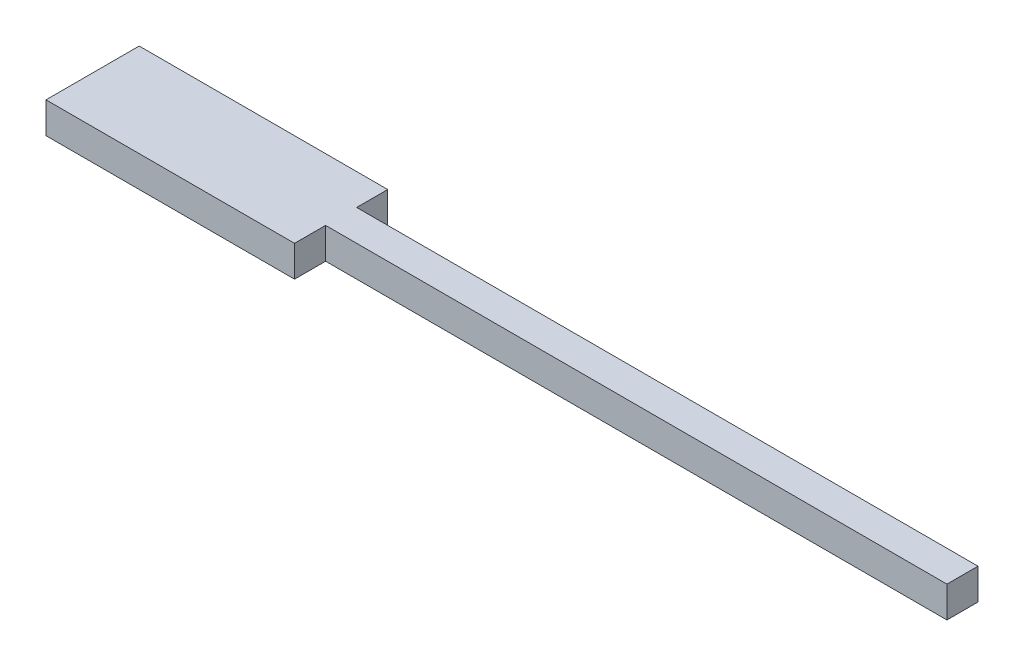
ISO-10303-21;
HEADER;
FILE_DESCRIPTION(('STEP AP214'),'2;1');
FILE_NAME('part.step','',(''),(''),'','','');
FILE_SCHEMA(('AUTOMOTIVE_DESIGN { 1 0 10303 214 1 1 1 1 }'));
ENDSEC;
DATA;
#1=APPLICATION_CONTEXT('core data for automotive mechanical design processes');
#2=APPLICATION_PROTOCOL_DEFINITION('international standard','automotive_design',2000,#1);
#3=PRODUCT_CONTEXT('',#1,'mechanical');
#4=PRODUCT('Part','Part','',(#3));
#5=PRODUCT_RELATED_PRODUCT_CATEGORY('part','',(#4));
#6=PRODUCT_DEFINITION_FORMATION('','',#4);
#7=PRODUCT_DEFINITION_CONTEXT('part definition',#1,'design');
#8=PRODUCT_DEFINITION('design','',#6,#7);
#9=PRODUCT_DEFINITION_SHAPE('','',#8);
#10=(LENGTH_UNIT() NAMED_UNIT(*) SI_UNIT(.MILLI.,.METRE.));
#11=(NAMED_UNIT(*) PLANE_ANGLE_UNIT() SI_UNIT($,.RADIAN.));
#12=(NAMED_UNIT(*) SI_UNIT($,.STERADIAN.) SOLID_ANGLE_UNIT());
#13=UNCERTAINTY_MEASURE_WITH_UNIT(LENGTH_MEASURE(1.E-05),#10,'distance_accuracy_value','');
#14=(GEOMETRIC_REPRESENTATION_CONTEXT(3) GLOBAL_UNCERTAINTY_ASSIGNED_CONTEXT((#13)) GLOBAL_UNIT_ASSIGNED_CONTEXT((#10,
#11,#12)) REPRESENTATION_CONTEXT('',''));
#15=CARTESIAN_POINT('',(0.,0.,0.));
#16=DIRECTION('',(0.,0.,1.));
#17=DIRECTION('',(1.,0.,0.));
#18=AXIS2_PLACEMENT_3D('',#15,#16,#17);
#19=CARTESIAN_POINT('',(0.,5.,-5.));
#20=DIRECTION('',(-1.,0.,0.));
#21=DIRECTION('',(0.,0.,1.));
#22=AXIS2_PLACEMENT_3D('',#19,#20,#21);
#23=PLANE('',#22);
#24=DIRECTION('',(0.,0.,-1.));
#25=VECTOR('',#24,1.);
#26=CARTESIAN_POINT('',(0.,0.,-5.));
#27=LINE('',#26,#25);
#28=CARTESIAN_POINT('',(0.,0.,0.));
#29=VERTEX_POINT('',#28);
#30=CARTESIAN_POINT('',(0.,0.,-5.));
#31=VERTEX_POINT('',#30);
#32=EDGE_CURVE('E140',#29,#31,#27,.T.);
#33=ORIENTED_EDGE('',*,*,#32,.T.);
#34=DIRECTION('',(0.,-1.,0.));
#35=VECTOR('',#34,1.);
#36=CARTESIAN_POINT('',(0.,5.,-5.));
#37=LINE('',#36,#35);
#38=CARTESIAN_POINT('',(0.,5.,-5.));
#39=VERTEX_POINT('',#38);
#40=EDGE_CURVE('E11',#39,#31,#37,.T.);
#41=ORIENTED_EDGE('',*,*,#40,.F.);
#42=DIRECTION('',(0.,0.,-1.));
#43=VECTOR('',#42,1.);
#44=CARTESIAN_POINT('',(0.,5.,-5.));
#45=LINE('',#44,#43);
#46=CARTESIAN_POINT('',(0.,5.,0.));
#47=VERTEX_POINT('',#46);
#48=EDGE_CURVE('E162',#47,#39,#45,.T.);
#49=ORIENTED_EDGE('',*,*,#48,.F.);
#50=DIRECTION('',(0.,-1.,0.));
#51=VECTOR('',#50,1.);
#52=CARTESIAN_POINT('',(0.,5.,0.));
#53=LINE('',#52,#51);
#54=EDGE_CURVE('E136',#47,#29,#53,.T.);
#55=ORIENTED_EDGE('',*,*,#54,.T.);
#56=EDGE_LOOP('',(#33,#41,#49,#55));
#57=FACE_BOUND('',#56,.T.);
#58=ADVANCED_FACE('F39',(#57),#23,.F.);
#59=CARTESIAN_POINT('',(0.,5.,-5.));
#60=DIRECTION('',(0.,0.,-1.));
#61=DIRECTION('',(-1.,0.,0.));
#62=AXIS2_PLACEMENT_3D('',#59,#60,#61);
#63=PLANE('',#62);
#64=DIRECTION('',(1.,0.,0.));
#65=VECTOR('',#64,1.);
#66=CARTESIAN_POINT('',(0.,0.,-5.));
#67=LINE('',#66,#65);
#68=CARTESIAN_POINT('',(100.,0.,-5.));
#69=VERTEX_POINT('',#68);
#70=EDGE_CURVE('E144',#31,#69,#67,.T.);
#71=ORIENTED_EDGE('',*,*,#70,.T.);
#72=DIRECTION('',(0.,-1.,0.));
#73=VECTOR('',#72,1.);
#74=CARTESIAN_POINT('',(100.,5.,-5.));
#75=LINE('',#74,#73);
#76=CARTESIAN_POINT('',(100.,5.,-5.));
#77=VERTEX_POINT('',#76);
#78=EDGE_CURVE('E48',#77,#69,#75,.T.);
#79=ORIENTED_EDGE('',*,*,#78,.F.);
#80=DIRECTION('',(1.,0.,0.));
#81=VECTOR('',#80,1.);
#82=CARTESIAN_POINT('',(0.,5.,-5.));
#83=LINE('',#82,#81);
#84=EDGE_CURVE('E99',#39,#77,#83,.T.);
#85=ORIENTED_EDGE('',*,*,#84,.F.);
#86=ORIENTED_EDGE('',*,*,#40,.T.);
#87=EDGE_LOOP('',(#71,#79,#85,#86));
#88=FACE_BOUND('',#87,.T.);
#89=ADVANCED_FACE('F208',(#88),#63,.F.);
#90=CARTESIAN_POINT('',(100.,5.,-10.));
#91=DIRECTION('',(-1.,0.,0.));
#92=DIRECTION('',(0.,0.,1.));
#93=AXIS2_PLACEMENT_3D('',#90,#91,#92);
#94=PLANE('',#93);
#95=DIRECTION('',(0.,0.,-1.));
#96=VECTOR('',#95,1.);
#97=CARTESIAN_POINT('',(100.,0.,-10.));
#98=LINE('',#97,#96);
#99=CARTESIAN_POINT('',(100.,0.,-10.));
#100=VERTEX_POINT('',#99);
#101=EDGE_CURVE('E147',#69,#100,#98,.T.);
#102=ORIENTED_EDGE('',*,*,#101,.T.);
#103=DIRECTION('',(0.,-1.,0.));
#104=VECTOR('',#103,1.);
#105=CARTESIAN_POINT('',(100.,5.,-10.));
#106=LINE('',#105,#104);
#107=CARTESIAN_POINT('',(100.,5.,-10.));
#108=VERTEX_POINT('',#107);
#109=EDGE_CURVE('E173',#108,#100,#106,.T.);
#110=ORIENTED_EDGE('',*,*,#109,.F.);
#111=DIRECTION('',(0.,0.,-1.));
#112=VECTOR('',#111,1.);
#113=CARTESIAN_POINT('',(100.,5.,-10.));
#114=LINE('',#113,#112);
#115=EDGE_CURVE('E183',#77,#108,#114,.T.);
#116=ORIENTED_EDGE('',*,*,#115,.F.);
#117=ORIENTED_EDGE('',*,*,#78,.T.);
#118=EDGE_LOOP('',(#102,#110,#116,#117));
#119=FACE_BOUND('',#118,.T.);
#120=ADVANCED_FACE('F181',(#119),#94,.F.);
#121=CARTESIAN_POINT('',(0.,5.,-9.99999999999999));
#122=DIRECTION('',(0.,0.,1.));
#123=DIRECTION('',(1.,0.,0.));
#124=AXIS2_PLACEMENT_3D('',#121,#122,#123);
#125=PLANE('',#124);
#126=DIRECTION('',(-1.,0.,0.));
#127=VECTOR('',#126,1.);
#128=CARTESIAN_POINT('',(0.,0.,-9.99999999999999));
#129=LINE('',#128,#127);
#130=CARTESIAN_POINT('',(0.,0.,-9.99999999999999));
#131=VERTEX_POINT('',#130);
#132=EDGE_CURVE('E150',#100,#131,#129,.T.);
#133=ORIENTED_EDGE('',*,*,#132,.T.);
#134=DIRECTION('',(0.,-1.,0.));
#135=VECTOR('',#134,1.);
#136=CARTESIAN_POINT('',(0.,5.,-9.99999999999999));
#137=LINE('',#136,#135);
#138=CARTESIAN_POINT('',(0.,5.,-9.99999999999999));
#139=VERTEX_POINT('',#138);
#140=EDGE_CURVE('E169',#139,#131,#137,.T.);
#141=ORIENTED_EDGE('',*,*,#140,.F.);
#142=DIRECTION('',(-1.,0.,0.));
#143=VECTOR('',#142,1.);
#144=CARTESIAN_POINT('',(0.,5.,-9.99999999999999));
#145=LINE('',#144,#143);
#146=EDGE_CURVE('E196',#108,#139,#145,.T.);
#147=ORIENTED_EDGE('',*,*,#146,.F.);
#148=ORIENTED_EDGE('',*,*,#109,.T.);
#149=EDGE_LOOP('',(#133,#141,#147,#148));
#150=FACE_BOUND('',#149,.T.);
#151=ADVANCED_FACE('F191',(#150),#125,.F.);
#152=CARTESIAN_POINT('',(0.,5.,-15.));
#153=DIRECTION('',(-1.,0.,0.));
#154=DIRECTION('',(0.,0.,1.));
#155=AXIS2_PLACEMENT_3D('',#152,#153,#154);
#156=PLANE('',#155);
#157=DIRECTION('',(0.,0.,-1.));
#158=VECTOR('',#157,1.);
#159=CARTESIAN_POINT('',(0.,0.,-15.));
#160=LINE('',#159,#158);
#161=CARTESIAN_POINT('',(0.,0.,-15.));
#162=VERTEX_POINT('',#161);
#163=EDGE_CURVE('E153',#131,#162,#160,.T.);
#164=ORIENTED_EDGE('',*,*,#163,.T.);
#165=DIRECTION('',(0.,-1.,0.));
#166=VECTOR('',#165,1.);
#167=CARTESIAN_POINT('',(0.,5.,-15.));
#168=LINE('',#167,#166);
#169=CARTESIAN_POINT('',(0.,5.,-15.));
#170=VERTEX_POINT('',#169);
#171=EDGE_CURVE('E129',#170,#162,#168,.T.);
#172=ORIENTED_EDGE('',*,*,#171,.F.);
#173=DIRECTION('',(0.,0.,-1.));
#174=VECTOR('',#173,1.);
#175=CARTESIAN_POINT('',(0.,5.,-15.));
#176=LINE('',#175,#174);
#177=EDGE_CURVE('E118',#139,#170,#176,.T.);
#178=ORIENTED_EDGE('',*,*,#177,.F.);
#179=ORIENTED_EDGE('',*,*,#140,.T.);
#180=EDGE_LOOP('',(#164,#172,#178,#179));
#181=FACE_BOUND('',#180,.T.);
#182=ADVANCED_FACE('F194',(#181),#156,.F.);
#183=CARTESIAN_POINT('',(0.,5.,-15.));
#184=DIRECTION('',(0.,0.,1.));
#185=DIRECTION('',(1.,0.,0.));
#186=AXIS2_PLACEMENT_3D('',#183,#184,#185);
#187=PLANE('',#186);
#188=DIRECTION('',(-1.,0.,0.));
#189=VECTOR('',#188,1.);
#190=CARTESIAN_POINT('',(0.,0.,-15.));
#191=LINE('',#190,#189);
#192=CARTESIAN_POINT('',(-40.,0.,-15.));
#193=VERTEX_POINT('',#192);
#194=EDGE_CURVE('E127',#162,#193,#191,.T.);
#195=ORIENTED_EDGE('',*,*,#194,.T.);
#196=DIRECTION('',(0.,-1.,0.));
#197=VECTOR('',#196,1.);
#198=CARTESIAN_POINT('',(-40.,5.,-15.));
#199=LINE('',#198,#197);
#200=CARTESIAN_POINT('',(-40.,5.,-15.));
#201=VERTEX_POINT('',#200);
#202=EDGE_CURVE('E124',#201,#193,#199,.T.);
#203=ORIENTED_EDGE('',*,*,#202,.F.);
#204=DIRECTION('',(-1.,0.,0.));
#205=VECTOR('',#204,1.);
#206=CARTESIAN_POINT('',(0.,5.,-15.));
#207=LINE('',#206,#205);
#208=EDGE_CURVE('E112',#170,#201,#207,.T.);
#209=ORIENTED_EDGE('',*,*,#208,.F.);
#210=ORIENTED_EDGE('',*,*,#171,.T.);
#211=EDGE_LOOP('',(#195,#203,#209,#210));
#212=FACE_BOUND('',#211,.T.);
#213=ADVANCED_FACE('F125',(#212),#187,.F.);
#214=CARTESIAN_POINT('',(-40.,5.,0.));
#215=DIRECTION('',(1.,0.,0.));
#216=DIRECTION('',(0.,0.,-1.));
#217=AXIS2_PLACEMENT_3D('',#214,#215,#216);
#218=PLANE('',#217);
#219=DIRECTION('',(0.,0.,1.));
#220=VECTOR('',#219,1.);
#221=CARTESIAN_POINT('',(-40.,0.,0.));
#222=LINE('',#221,#220);
#223=CARTESIAN_POINT('',(-40.,0.,0.));
#224=VERTEX_POINT('',#223);
#225=EDGE_CURVE('E85',#193,#224,#222,.T.);
#226=ORIENTED_EDGE('',*,*,#225,.T.);
#227=DIRECTION('',(0.,-1.,0.));
#228=VECTOR('',#227,1.);
#229=CARTESIAN_POINT('',(-40.,5.,0.));
#230=LINE('',#229,#228);
#231=CARTESIAN_POINT('',(-40.,5.,0.));
#232=VERTEX_POINT('',#231);
#233=EDGE_CURVE('E130',#232,#224,#230,.T.);
#234=ORIENTED_EDGE('',*,*,#233,.F.);
#235=DIRECTION('',(0.,0.,1.));
#236=VECTOR('',#235,1.);
#237=CARTESIAN_POINT('',(-40.,5.,0.));
#238=LINE('',#237,#236);
#239=EDGE_CURVE('E116',#201,#232,#238,.T.);
#240=ORIENTED_EDGE('',*,*,#239,.F.);
#241=ORIENTED_EDGE('',*,*,#202,.T.);
#242=EDGE_LOOP('',(#226,#234,#240,#241));
#243=FACE_BOUND('',#242,.T.);
#244=ADVANCED_FACE('F132',(#243),#218,.F.);
#245=CARTESIAN_POINT('',(0.,5.,0.));
#246=DIRECTION('',(0.,0.,-1.));
#247=DIRECTION('',(-1.,0.,0.));
#248=AXIS2_PLACEMENT_3D('',#245,#246,#247);
#249=PLANE('',#248);
#250=DIRECTION('',(1.,0.,0.));
#251=VECTOR('',#250,1.);
#252=CARTESIAN_POINT('',(0.,0.,0.));
#253=LINE('',#252,#251);
#254=EDGE_CURVE('E91',#224,#29,#253,.T.);
#255=ORIENTED_EDGE('',*,*,#254,.T.);
#256=ORIENTED_EDGE('',*,*,#54,.F.);
#257=DIRECTION('',(1.,0.,0.));
#258=VECTOR('',#257,1.);
#259=CARTESIAN_POINT('',(0.,5.,0.));
#260=LINE('',#259,#258);
#261=EDGE_CURVE('E56',#232,#47,#260,.T.);
#262=ORIENTED_EDGE('',*,*,#261,.F.);
#263=ORIENTED_EDGE('',*,*,#233,.T.);
#264=EDGE_LOOP('',(#255,#256,#262,#263));
#265=FACE_BOUND('',#264,.T.);
#266=ADVANCED_FACE('F224',(#265),#249,.F.);
#267=CARTESIAN_POINT('',(0.,5.,0.));
#268=DIRECTION('',(0.,-1.,0.));
#269=DIRECTION('',(0.,0.,-1.));
#270=AXIS2_PLACEMENT_3D('',#267,#268,#269);
#271=PLANE('',#270);
#272=ORIENTED_EDGE('',*,*,#48,.T.);
#273=ORIENTED_EDGE('',*,*,#84,.T.);
#274=ORIENTED_EDGE('',*,*,#115,.T.);
#275=ORIENTED_EDGE('',*,*,#146,.T.);
#276=ORIENTED_EDGE('',*,*,#177,.T.);
#277=ORIENTED_EDGE('',*,*,#208,.T.);
#278=ORIENTED_EDGE('',*,*,#239,.T.);
#279=ORIENTED_EDGE('',*,*,#261,.T.);
#280=EDGE_LOOP('',(#272,#273,#274,#275,#276,#277,#278,#279));
#281=FACE_BOUND('',#280,.T.);
#282=ADVANCED_FACE('F114',(#281),#271,.F.);
#283=CARTESIAN_POINT('',(0.,0.,0.));
#284=DIRECTION('',(0.,-1.,0.));
#285=DIRECTION('',(0.,0.,-1.));
#286=AXIS2_PLACEMENT_3D('',#283,#284,#285);
#287=PLANE('',#286);
#288=ORIENTED_EDGE('',*,*,#32,.F.);
#289=ORIENTED_EDGE('',*,*,#254,.F.);
#290=ORIENTED_EDGE('',*,*,#225,.F.);
#291=ORIENTED_EDGE('',*,*,#194,.F.);
#292=ORIENTED_EDGE('',*,*,#163,.F.);
#293=ORIENTED_EDGE('',*,*,#132,.F.);
#294=ORIENTED_EDGE('',*,*,#101,.F.);
#295=ORIENTED_EDGE('',*,*,#70,.F.);
#296=EDGE_LOOP('',(#288,#289,#290,#291,#292,#293,#294,#295));
#297=FACE_BOUND('',#296,.T.);
#298=ADVANCED_FACE('F187',(#297),#287,.T.);
#299=CLOSED_SHELL('',(#58,#89,#120,#151,#182,#213,#244,#266,#282,#298));
#300=MANIFOLD_SOLID_BREP('B2',#299);
#301=ADVANCED_BREP_SHAPE_REPRESENTATION('',(#18,#300),#14);
#302=SHAPE_DEFINITION_REPRESENTATION(#9,#301);
ENDSEC;
END-ISO-10303-21;
